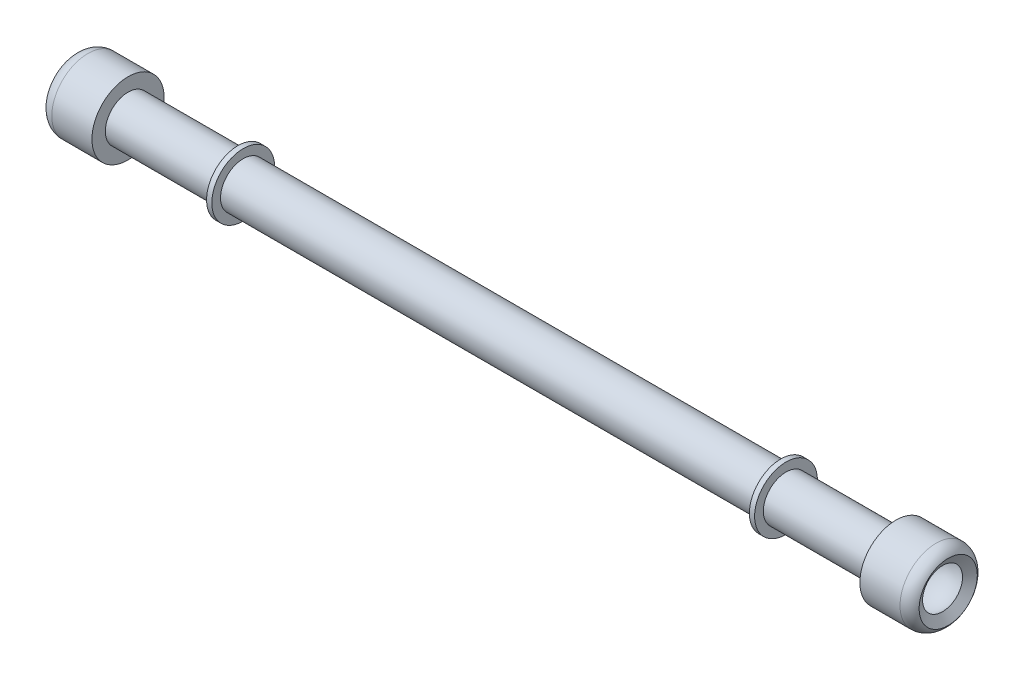
ISO-10303-21;
HEADER;
FILE_DESCRIPTION(('STEP AP214'),'2;1');
FILE_NAME('part.step','',(''),(''),'','','');
FILE_SCHEMA(('AUTOMOTIVE_DESIGN { 1 0 10303 214 1 1 1 1 }'));
ENDSEC;
DATA;
#1=APPLICATION_CONTEXT('core data for automotive mechanical design processes');
#2=APPLICATION_PROTOCOL_DEFINITION('international standard','automotive_design',2000,#1);
#3=PRODUCT_CONTEXT('',#1,'mechanical');
#4=PRODUCT('Part','Part','',(#3));
#5=PRODUCT_RELATED_PRODUCT_CATEGORY('part','',(#4));
#6=PRODUCT_DEFINITION_FORMATION('','',#4);
#7=PRODUCT_DEFINITION_CONTEXT('part definition',#1,'design');
#8=PRODUCT_DEFINITION('design','',#6,#7);
#9=PRODUCT_DEFINITION_SHAPE('','',#8);
#10=(LENGTH_UNIT() NAMED_UNIT(*) SI_UNIT(.MILLI.,.METRE.));
#11=(NAMED_UNIT(*) PLANE_ANGLE_UNIT() SI_UNIT($,.RADIAN.));
#12=(NAMED_UNIT(*) SI_UNIT($,.STERADIAN.) SOLID_ANGLE_UNIT());
#13=UNCERTAINTY_MEASURE_WITH_UNIT(LENGTH_MEASURE(1.E-05),#10,'distance_accuracy_value','');
#14=(GEOMETRIC_REPRESENTATION_CONTEXT(3) GLOBAL_UNCERTAINTY_ASSIGNED_CONTEXT((#13)) GLOBAL_UNIT_ASSIGNED_CONTEXT((#10,
#11,#12)) REPRESENTATION_CONTEXT('',''));
#15=CARTESIAN_POINT('',(0.,0.,0.));
#16=DIRECTION('',(0.,0.,1.));
#17=DIRECTION('',(1.,0.,0.));
#18=AXIS2_PLACEMENT_3D('',#15,#16,#17);
#19=CARTESIAN_POINT('',(220.,0.,0.));
#20=DIRECTION('',(-1.,0.,0.));
#21=DIRECTION('',(0.,0.,1.));
#22=AXIS2_PLACEMENT_3D('',#19,#20,#21);
#23=CYLINDRICAL_SURFACE('',#22,13.);
#24=CARTESIAN_POINT('',(154.,0.,0.));
#25=DIRECTION('',(1.,0.,0.));
#26=DIRECTION('',(0.,0.,-1.));
#27=AXIS2_PLACEMENT_3D('',#24,#25,#26);
#28=CIRCLE('',#27,13.);
#29=CARTESIAN_POINT('',(154.,0.,-13.));
#30=VERTEX_POINT('',#29);
#31=EDGE_CURVE('E65',#30,#30,#28,.T.);
#32=ORIENTED_EDGE('',*,*,#31,.F.);
#33=EDGE_LOOP('',(#32));
#34=FACE_BOUND('',#33,.T.);
#35=CARTESIAN_POINT('',(-154.,0.,0.));
#36=DIRECTION('',(-1.,0.,0.));
#37=DIRECTION('',(0.,0.,1.));
#38=AXIS2_PLACEMENT_3D('',#35,#36,#37);
#39=CIRCLE('',#38,13.);
#40=CARTESIAN_POINT('',(-154.,0.,13.));
#41=VERTEX_POINT('',#40);
#42=EDGE_CURVE('E10',#41,#41,#39,.T.);
#43=ORIENTED_EDGE('',*,*,#42,.F.);
#44=EDGE_LOOP('',(#43));
#45=FACE_BOUND('',#44,.T.);
#46=ADVANCED_FACE('F41',(#34,#45),#23,.T.);
#47=CARTESIAN_POINT('',(157.,0.,0.));
#48=DIRECTION('',(1.,0.,0.));
#49=DIRECTION('',(0.,0.,-1.));
#50=AXIS2_PLACEMENT_3D('',#47,#48,#49);
#51=CIRCLE('',#50,13.);
#52=CARTESIAN_POINT('',(157.,0.,-13.));
#53=VERTEX_POINT('',#52);
#54=EDGE_CURVE('E66',#53,#53,#51,.T.);
#55=ORIENTED_EDGE('',*,*,#54,.T.);
#56=EDGE_LOOP('',(#55));
#57=FACE_BOUND('',#56,.T.);
#58=CARTESIAN_POINT('',(220.,0.,0.));
#59=DIRECTION('',(1.,0.,0.));
#60=DIRECTION('',(0.,0.,-1.));
#61=AXIS2_PLACEMENT_3D('',#58,#59,#60);
#62=CIRCLE('',#61,13.);
#63=CARTESIAN_POINT('',(220.,0.,-13.));
#64=VERTEX_POINT('',#63);
#65=EDGE_CURVE('E82',#64,#64,#62,.T.);
#66=ORIENTED_EDGE('',*,*,#65,.F.);
#67=EDGE_LOOP('',(#66));
#68=FACE_BOUND('',#67,.T.);
#69=ADVANCED_FACE('F127',(#57,#68),#23,.T.);
#70=CARTESIAN_POINT('',(251.,0.,0.));
#71=DIRECTION('',(-1.,0.,0.));
#72=DIRECTION('',(0.,0.,1.));
#73=AXIS2_PLACEMENT_3D('',#70,#71,#72);
#74=CYLINDRICAL_SURFACE('',#73,20.690094219506);
#75=CARTESIAN_POINT('',(243.,0.,0.));
#76=DIRECTION('',(1.,0.,0.));
#77=DIRECTION('',(0.,0.,-1.));
#78=AXIS2_PLACEMENT_3D('',#75,#76,#77);
#79=CIRCLE('',#78,20.690094219506);
#80=CARTESIAN_POINT('',(243.,0.,-20.690094219506));
#81=VERTEX_POINT('',#80);
#82=EDGE_CURVE('E79',#81,#81,#79,.F.);
#83=ORIENTED_EDGE('',*,*,#82,.T.);
#84=EDGE_LOOP('',(#83));
#85=FACE_BOUND('',#84,.T.);
#86=CARTESIAN_POINT('',(220.,0.,0.));
#87=DIRECTION('',(1.,0.,0.));
#88=DIRECTION('',(0.,0.,-1.));
#89=AXIS2_PLACEMENT_3D('',#86,#87,#88);
#90=CIRCLE('',#89,20.690094219506);
#91=CARTESIAN_POINT('',(220.,0.,-20.690094219506));
#92=VERTEX_POINT('',#91);
#93=EDGE_CURVE('E69',#92,#92,#90,.T.);
#94=ORIENTED_EDGE('',*,*,#93,.T.);
#95=EDGE_LOOP('',(#94));
#96=FACE_BOUND('',#95,.T.);
#97=ADVANCED_FACE('F134',(#85,#96),#74,.T.);
#98=CARTESIAN_POINT('',(220.,0.,0.));
#99=DIRECTION('',(1.,0.,0.));
#100=DIRECTION('',(0.,0.,-1.));
#101=AXIS2_PLACEMENT_3D('',#98,#99,#100);
#102=PLANE('',#101);
#103=ORIENTED_EDGE('',*,*,#65,.T.);
#104=EDGE_LOOP('',(#103));
#105=FACE_BOUND('',#104,.T.);
#106=ORIENTED_EDGE('',*,*,#93,.F.);
#107=EDGE_LOOP('',(#106));
#108=FACE_BOUND('',#107,.T.);
#109=ADVANCED_FACE('F179',(#105,#108),#102,.F.);
#110=CARTESIAN_POINT('',(243.,0.,0.));
#111=DIRECTION('',(1.,0.,0.));
#112=DIRECTION('',(0.,0.,-1.));
#113=AXIS2_PLACEMENT_3D('',#110,#111,#112);
#114=TOROIDAL_SURFACE('',#113,12.690094219506,8.);
#115=CARTESIAN_POINT('',(249.938653286796,0.,0.));
#116=DIRECTION('',(-1.,0.,0.));
#117=DIRECTION('',(0.,0.,1.));
#118=AXIS2_PLACEMENT_3D('',#115,#116,#117);
#119=CIRCLE('',#118,16.6719393402556);
#120=CARTESIAN_POINT('',(249.938653286796,0.,16.6719393402556));
#121=VERTEX_POINT('',#120);
#122=EDGE_CURVE('E73',#121,#121,#119,.T.);
#123=ORIENTED_EDGE('',*,*,#122,.T.);
#124=EDGE_LOOP('',(#123));
#125=FACE_BOUND('',#124,.T.);
#126=ORIENTED_EDGE('',*,*,#82,.F.);
#127=EDGE_LOOP('',(#126));
#128=FACE_BOUND('',#127,.T.);
#129=ADVANCED_FACE('F177',(#125,#128),#114,.T.);
#130=CARTESIAN_POINT('',(237.,0.,0.));
#131=DIRECTION('',(0.,0.,-1.));
#132=DIRECTION('',(0.,1.,0.));
#133=AXIS2_PLACEMENT_3D('',#130,#131,#132);
#134=SPHERICAL_SURFACE('',#133,15.);
#135=CARTESIAN_POINT('',(237.,0.,0.));
#136=DIRECTION('',(-1.,0.,0.));
#137=DIRECTION('',(0.,0.,1.));
#138=AXIS2_PLACEMENT_3D('',#135,#136,#137);
#139=SPHERICAL_SURFACE('',#138,15.);
#140=CARTESIAN_POINT('',(246.699355741803,0.,0.));
#141=DIRECTION('',(-1.,0.,0.));
#142=DIRECTION('',(0.,0.,1.));
#143=AXIS2_PLACEMENT_3D('',#140,#141,#142);
#144=CIRCLE('',#143,11.4421369592376);
#145=CARTESIAN_POINT('',(246.699355741803,0.,11.4421369592376));
#146=VERTEX_POINT('',#145);
#147=EDGE_CURVE('E76',#146,#146,#144,.F.);
#148=ORIENTED_EDGE('',*,*,#147,.T.);
#149=EDGE_LOOP('',(#148));
#150=FACE_BOUND('',#149,.T.);
#151=ADVANCED_FACE('F174',(#150),#139,.F.);
#152=CARTESIAN_POINT('',(246.699355741803,0.,0.));
#153=DIRECTION('',(1.,0.,0.));
#154=DIRECTION('',(0.,0.,-1.));
#155=AXIS2_PLACEMENT_3D('',#152,#153,#154);
#156=CONICAL_SURFACE('',#155,11.4421369592376,1.01623992768622);
#157=ORIENTED_EDGE('',*,*,#122,.F.);
#158=EDGE_LOOP('',(#157));
#159=FACE_BOUND('',#158,.T.);
#160=ORIENTED_EDGE('',*,*,#147,.F.);
#161=EDGE_LOOP('',(#160));
#162=FACE_BOUND('',#161,.T.);
#163=ADVANCED_FACE('F172',(#159,#162),#156,.F.);
#164=CARTESIAN_POINT('',(157.,0.,0.));
#165=DIRECTION('',(-1.,0.,0.));
#166=DIRECTION('',(0.,0.,1.));
#167=AXIS2_PLACEMENT_3D('',#164,#165,#166);
#168=CYLINDRICAL_SURFACE('',#167,18.);
#169=CARTESIAN_POINT('',(157.,0.,0.));
#170=DIRECTION('',(1.,0.,0.));
#171=DIRECTION('',(0.,0.,-1.));
#172=AXIS2_PLACEMENT_3D('',#169,#170,#171);
#173=CIRCLE('',#172,18.);
#174=CARTESIAN_POINT('',(157.,0.,-18.));
#175=VERTEX_POINT('',#174);
#176=EDGE_CURVE('E70',#175,#175,#173,.T.);
#177=ORIENTED_EDGE('',*,*,#176,.F.);
#178=EDGE_LOOP('',(#177));
#179=FACE_BOUND('',#178,.T.);
#180=CARTESIAN_POINT('',(154.,0.,0.));
#181=DIRECTION('',(1.,0.,0.));
#182=DIRECTION('',(0.,0.,-1.));
#183=AXIS2_PLACEMENT_3D('',#180,#181,#182);
#184=CIRCLE('',#183,18.);
#185=CARTESIAN_POINT('',(154.,0.,-18.));
#186=VERTEX_POINT('',#185);
#187=EDGE_CURVE('E86',#186,#186,#184,.T.);
#188=ORIENTED_EDGE('',*,*,#187,.T.);
#189=EDGE_LOOP('',(#188));
#190=FACE_BOUND('',#189,.T.);
#191=ADVANCED_FACE('F165',(#179,#190),#168,.T.);
#192=CARTESIAN_POINT('',(157.,0.,0.));
#193=DIRECTION('',(1.,0.,0.));
#194=DIRECTION('',(0.,0.,-1.));
#195=AXIS2_PLACEMENT_3D('',#192,#193,#194);
#196=PLANE('',#195);
#197=ORIENTED_EDGE('',*,*,#54,.F.);
#198=EDGE_LOOP('',(#197));
#199=FACE_BOUND('',#198,.T.);
#200=ORIENTED_EDGE('',*,*,#176,.T.);
#201=EDGE_LOOP('',(#200));
#202=FACE_BOUND('',#201,.T.);
#203=ADVANCED_FACE('F162',(#199,#202),#196,.T.);
#204=CARTESIAN_POINT('',(154.,0.,0.));
#205=DIRECTION('',(1.,0.,0.));
#206=DIRECTION('',(0.,0.,-1.));
#207=AXIS2_PLACEMENT_3D('',#204,#205,#206);
#208=PLANE('',#207);
#209=ORIENTED_EDGE('',*,*,#31,.T.);
#210=EDGE_LOOP('',(#209));
#211=FACE_BOUND('',#210,.T.);
#212=ORIENTED_EDGE('',*,*,#187,.F.);
#213=EDGE_LOOP('',(#212));
#214=FACE_BOUND('',#213,.T.);
#215=ADVANCED_FACE('F124',(#211,#214),#208,.F.);
#216=CARTESIAN_POINT('',(-157.,0.,0.));
#217=DIRECTION('',(1.,0.,0.));
#218=DIRECTION('',(0.,0.,-1.));
#219=AXIS2_PLACEMENT_3D('',#216,#217,#218);
#220=CYLINDRICAL_SURFACE('',#219,18.);
#221=CARTESIAN_POINT('',(-157.,0.,0.));
#222=DIRECTION('',(1.,0.,0.));
#223=DIRECTION('',(0.,0.,-1.));
#224=AXIS2_PLACEMENT_3D('',#221,#222,#223);
#225=CIRCLE('',#224,18.);
#226=CARTESIAN_POINT('',(-157.,0.,-18.));
#227=VERTEX_POINT('',#226);
#228=EDGE_CURVE('E101',#227,#227,#225,.T.);
#229=ORIENTED_EDGE('',*,*,#228,.T.);
#230=EDGE_LOOP('',(#229));
#231=FACE_BOUND('',#230,.T.);
#232=CARTESIAN_POINT('',(-154.,0.,0.));
#233=DIRECTION('',(1.,0.,0.));
#234=DIRECTION('',(0.,0.,-1.));
#235=AXIS2_PLACEMENT_3D('',#232,#233,#234);
#236=CIRCLE('',#235,18.);
#237=CARTESIAN_POINT('',(-154.,0.,-18.));
#238=VERTEX_POINT('',#237);
#239=EDGE_CURVE('E98',#238,#238,#236,.T.);
#240=ORIENTED_EDGE('',*,*,#239,.F.);
#241=EDGE_LOOP('',(#240));
#242=FACE_BOUND('',#241,.T.);
#243=ADVANCED_FACE('F115',(#231,#242),#220,.T.);
#244=CARTESIAN_POINT('',(-157.,0.,0.));
#245=DIRECTION('',(-1.,0.,0.));
#246=DIRECTION('',(0.,0.,-1.));
#247=AXIS2_PLACEMENT_3D('',#244,#245,#246);
#248=PLANE('',#247);
#249=CARTESIAN_POINT('',(-157.,0.,0.));
#250=DIRECTION('',(-1.,0.,0.));
#251=DIRECTION('',(0.,0.,1.));
#252=AXIS2_PLACEMENT_3D('',#249,#250,#251);
#253=CIRCLE('',#252,13.);
#254=CARTESIAN_POINT('',(-157.,0.,13.));
#255=VERTEX_POINT('',#254);
#256=EDGE_CURVE('E46',#255,#255,#253,.T.);
#257=ORIENTED_EDGE('',*,*,#256,.F.);
#258=EDGE_LOOP('',(#257));
#259=FACE_BOUND('',#258,.T.);
#260=ORIENTED_EDGE('',*,*,#228,.F.);
#261=EDGE_LOOP('',(#260));
#262=FACE_BOUND('',#261,.T.);
#263=ADVANCED_FACE('F111',(#259,#262),#248,.T.);
#264=CARTESIAN_POINT('',(-154.,0.,0.));
#265=DIRECTION('',(-1.,0.,0.));
#266=DIRECTION('',(0.,0.,-1.));
#267=AXIS2_PLACEMENT_3D('',#264,#265,#266);
#268=PLANE('',#267);
#269=ORIENTED_EDGE('',*,*,#42,.T.);
#270=EDGE_LOOP('',(#269));
#271=FACE_BOUND('',#270,.T.);
#272=ORIENTED_EDGE('',*,*,#239,.T.);
#273=EDGE_LOOP('',(#272));
#274=FACE_BOUND('',#273,.T.);
#275=ADVANCED_FACE('F114',(#271,#274),#268,.F.);
#276=CARTESIAN_POINT('',(-237.,0.,0.));
#277=DIRECTION('',(0.,0.,-1.));
#278=DIRECTION('',(0.,1.,0.));
#279=AXIS2_PLACEMENT_3D('',#276,#277,#278);
#280=SPHERICAL_SURFACE('',#279,15.);
#281=CARTESIAN_POINT('',(-237.,0.,0.));
#282=DIRECTION('',(1.,0.,0.));
#283=DIRECTION('',(0.,0.,-1.));
#284=AXIS2_PLACEMENT_3D('',#281,#282,#283);
#285=SPHERICAL_SURFACE('',#284,15.);
#286=CARTESIAN_POINT('',(-243.568850988811,0.,0.));
#287=DIRECTION('',(1.,0.,0.));
#288=DIRECTION('',(0.,0.,-1.));
#289=AXIS2_PLACEMENT_3D('',#286,#287,#288);
#290=CIRCLE('',#289,13.4851843401118);
#291=CARTESIAN_POINT('',(-243.568850988811,0.,-13.4851843401118));
#292=VERTEX_POINT('',#291);
#293=EDGE_CURVE('E54',#292,#292,#290,.F.);
#294=ORIENTED_EDGE('',*,*,#293,.T.);
#295=EDGE_LOOP('',(#294));
#296=FACE_BOUND('',#295,.T.);
#297=ADVANCED_FACE('F122',(#296),#285,.F.);
#298=CARTESIAN_POINT('',(-243.568850988811,0.,0.));
#299=DIRECTION('',(1.,0.,0.));
#300=DIRECTION('',(0.,0.,-1.));
#301=AXIS2_PLACEMENT_3D('',#298,#299,#300);
#302=CONICAL_SURFACE('',#301,13.4851843401118,0.313587644342779);
#303=CARTESIAN_POINT('',(-251.,0.,0.));
#304=DIRECTION('',(-1.,0.,0.));
#305=DIRECTION('',(0.,0.,1.));
#306=AXIS2_PLACEMENT_3D('',#303,#304,#305);
#307=CIRCLE('',#306,11.0753530423962);
#308=CARTESIAN_POINT('',(-251.,0.,-11.0753530423962));
#309=VERTEX_POINT('',#308);
#310=EDGE_CURVE('E50',#309,#309,#307,.F.);
#311=CARTESIAN_POINT('',(-251.,0.,-11.0753530423962));
#312=CARTESIAN_POINT('',(-250.9225921978,0.,-11.1004554517474));
#313=CARTESIAN_POINT('',(-250.8451843956,0.,-11.1255578610986));
#314=CARTESIAN_POINT('',(-250.6903687912,0.,-11.175762679801));
#315=CARTESIAN_POINT('',(-250.612960989001,0.,-11.2008650891522));
#316=CARTESIAN_POINT('',(-250.458145384601,0.,-11.2510699078546));
#317=CARTESIAN_POINT('',(-250.380737582401,0.,-11.2761723172059));
#318=CARTESIAN_POINT('',(-250.225921978001,0.,-11.3263771359083));
#319=CARTESIAN_POINT('',(-250.148514175801,0.,-11.3514795452595));
#320=CARTESIAN_POINT('',(-249.993698571401,0.,-11.4016843639619));
#321=CARTESIAN_POINT('',(-249.916290769202,0.,-11.4267867733131));
#322=CARTESIAN_POINT('',(-249.761475164802,0.,-11.4769915920155));
#323=CARTESIAN_POINT('',(-249.684067362602,0.,-11.5020940013667));
#324=CARTESIAN_POINT('',(-249.529251758202,0.,-11.5522988200691));
#325=CARTESIAN_POINT('',(-249.451843956002,0.,-11.5774012294203));
#326=CARTESIAN_POINT('',(-249.297028351603,0.,-11.6276060481227));
#327=CARTESIAN_POINT('',(-249.219620549403,0.,-11.6527084574739));
#328=CARTESIAN_POINT('',(-249.064804945003,0.,-11.7029132761763));
#329=CARTESIAN_POINT('',(-248.987397142803,0.,-11.7280156855275));
#330=CARTESIAN_POINT('',(-248.832581538403,0.,-11.7782205042299));
#331=CARTESIAN_POINT('',(-248.755173736203,0.,-11.8033229135811));
#332=CARTESIAN_POINT('',(-248.600358131804,0.,-11.8535277322835));
#333=CARTESIAN_POINT('',(-248.522950329604,0.,-11.8786301416347));
#334=CARTESIAN_POINT('',(-248.368134725204,0.,-11.9288349603371));
#335=CARTESIAN_POINT('',(-248.290726923004,0.,-11.9539373696883));
#336=CARTESIAN_POINT('',(-248.135911318604,0.,-12.0041421883908));
#337=CARTESIAN_POINT('',(-248.058503516404,0.,-12.029244597742));
#338=CARTESIAN_POINT('',(-247.903687912005,0.,-12.0794494164444));
#339=CARTESIAN_POINT('',(-247.826280109805,0.,-12.1045518257956));
#340=CARTESIAN_POINT('',(-247.671464505405,0.,-12.154756644498));
#341=CARTESIAN_POINT('',(-247.594056703205,0.,-12.1798590538492));
#342=CARTESIAN_POINT('',(-247.439241098805,0.,-12.2300638725516));
#343=CARTESIAN_POINT('',(-247.361833296605,0.,-12.2551662819028));
#344=CARTESIAN_POINT('',(-247.207017692206,0.,-12.3053711006052));
#345=CARTESIAN_POINT('',(-247.129609890006,0.,-12.3304735099564));
#346=CARTESIAN_POINT('',(-246.974794285606,0.,-12.3806783286588));
#347=CARTESIAN_POINT('',(-246.897386483406,0.,-12.40578073801));
#348=CARTESIAN_POINT('',(-246.742570879006,0.,-12.4559855567124));
#349=CARTESIAN_POINT('',(-246.665163076806,0.,-12.4810879660636));
#350=CARTESIAN_POINT('',(-246.510347472407,0.,-12.531292784766));
#351=CARTESIAN_POINT('',(-246.432939670207,0.,-12.5563951941172));
#352=CARTESIAN_POINT('',(-246.278124065807,0.,-12.6066000128196));
#353=CARTESIAN_POINT('',(-246.200716263607,0.,-12.6317024221708));
#354=CARTESIAN_POINT('',(-246.045900659207,0.,-12.6819072408732));
#355=CARTESIAN_POINT('',(-245.968492857008,0.,-12.7070096502244));
#356=CARTESIAN_POINT('',(-245.813677252608,0.,-12.7572144689269));
#357=CARTESIAN_POINT('',(-245.736269450408,0.,-12.7823168782781));
#358=CARTESIAN_POINT('',(-245.581453846008,0.,-12.8325216969805));
#359=CARTESIAN_POINT('',(-245.504046043808,0.,-12.8576241063317));
#360=CARTESIAN_POINT('',(-245.349230439408,0.,-12.9078289250341));
#361=CARTESIAN_POINT('',(-245.271822637209,0.,-12.9329313343853));
#362=CARTESIAN_POINT('',(-245.117007032809,0.,-12.9831361530877));
#363=CARTESIAN_POINT('',(-245.039599230609,0.,-13.0082385624389));
#364=CARTESIAN_POINT('',(-244.884783626209,0.,-13.0584433811413));
#365=CARTESIAN_POINT('',(-244.807375824009,0.,-13.0835457904925));
#366=CARTESIAN_POINT('',(-244.652560219609,0.,-13.1337506091949));
#367=CARTESIAN_POINT('',(-244.57515241741,0.,-13.1588530185461));
#368=CARTESIAN_POINT('',(-244.42033681301,0.,-13.2090578372485));
#369=CARTESIAN_POINT('',(-244.34292901081,0.,-13.2341602465997));
#370=CARTESIAN_POINT('',(-244.18811340641,0.,-13.2843650653021));
#371=CARTESIAN_POINT('',(-244.11070560421,0.,-13.3094674746533));
#372=CARTESIAN_POINT('',(-243.955889999811,0.,-13.3596722933557));
#373=CARTESIAN_POINT('',(-243.878482197611,0.,-13.3847747027069));
#374=CARTESIAN_POINT('',(-243.723666593211,0.,-13.4349795214093));
#375=CARTESIAN_POINT('',(-243.646258791011,0.,-13.4600819307606));
#376=CARTESIAN_POINT('',(-243.568850988811,0.,-13.4851843401118));
#377=B_SPLINE_CURVE_WITH_KNOTS('',3,(#311,#312,#313,#314,#315,#316,#317,#318,#319,#320,#321,
#322,#323,#324,#325,#326,#327,#328,#329,#330,#331,#332,#333,#334,#335,#336,#337,#338,#339,#340,
#341,#342,#343,#344,#345,#346,#347,#348,#349,#350,#351,#352,#353,#354,#355,#356,#357,#358,#359,
#360,#361,#362,#363,#364,#365,#366,#367,#368,#369,#370,#371,#372,#373,#374,#375,#376),
.UNSPECIFIED.,.F.,.F.,(4,2,2,2,2,2,2,2,2,2,2,2,2,2,2,2,2,2,2,2,2,2,2,2,2,2,2,2,2,2,2,2,4),(0.,
0.244128837235281,0.488257674470615,0.732386511705896,0.97651534894123,1.22064418617654,
1.46477302341184,1.70890186064715,1.95303069788249,2.19715953511779,2.4412883723531,
2.68541720958841,2.92954604682372,3.17367488405905,3.41780372129436,3.66193255852966,
3.90606139576497,4.15019023300028,4.39431907023561,4.63844790747092,4.88257674470623,
5.12670558194153,5.37083441917684,5.61496325641218,5.85909209364748,6.10322093088279,
6.3473497681181,6.59147860535343,6.83560744258874,7.07973627982405,7.32386511705935,
7.56799395429466,7.81212279153),.UNSPECIFIED.);
#378=EDGE_CURVE('BSEAM44',#309,#292,#377,.T.);
#379=ORIENTED_EDGE('',*,*,#310,.F.);
#380=ORIENTED_EDGE('',*,*,#293,.F.);
#381=ORIENTED_EDGE('',*,*,#378,.T.);
#382=ORIENTED_EDGE('',*,*,#378,.F.);
#383=EDGE_LOOP('',(#379,#381,#380,#382));
#384=FACE_BOUND('',#383,.T.);
#385=ADVANCED_FACE('F44',(#384),#302,.F.);
#386=CARTESIAN_POINT('',(-251.,0.,0.));
#387=DIRECTION('',(-1.,0.,0.));
#388=DIRECTION('',(0.,0.,-1.));
#389=AXIS2_PLACEMENT_3D('',#386,#387,#388);
#390=PLANE('',#389);
#391=ORIENTED_EDGE('',*,*,#310,.T.);
#392=EDGE_LOOP('',(#391));
#393=FACE_BOUND('',#392,.T.);
#394=CARTESIAN_POINT('',(-251.,0.,0.));
#395=DIRECTION('',(-1.,0.,0.));
#396=DIRECTION('',(0.,0.,1.));
#397=AXIS2_PLACEMENT_3D('',#394,#395,#396);
#398=CIRCLE('',#397,12.690094219506);
#399=CARTESIAN_POINT('',(-251.,0.,12.690094219506));
#400=VERTEX_POINT('',#399);
#401=EDGE_CURVE('E59',#400,#400,#398,.T.);
#402=ORIENTED_EDGE('',*,*,#401,.T.);
#403=EDGE_LOOP('',(#402));
#404=FACE_BOUND('',#403,.T.);
#405=ADVANCED_FACE('F159',(#393,#404),#390,.T.);
#406=CARTESIAN_POINT('',(-243.,0.,0.));
#407=DIRECTION('',(-1.,0.,0.));
#408=DIRECTION('',(0.,0.,1.));
#409=AXIS2_PLACEMENT_3D('',#406,#407,#408);
#410=TOROIDAL_SURFACE('',#409,12.690094219506,8.);
#411=ORIENTED_EDGE('',*,*,#401,.F.);
#412=EDGE_LOOP('',(#411));
#413=FACE_BOUND('',#412,.T.);
#414=CARTESIAN_POINT('',(-243.,0.,0.));
#415=DIRECTION('',(-1.,0.,0.));
#416=DIRECTION('',(0.,0.,1.));
#417=AXIS2_PLACEMENT_3D('',#414,#415,#416);
#418=CIRCLE('',#417,20.690094219506);
#419=CARTESIAN_POINT('',(-243.,0.,20.690094219506));
#420=VERTEX_POINT('',#419);
#421=EDGE_CURVE('E62',#420,#420,#418,.F.);
#422=ORIENTED_EDGE('',*,*,#421,.F.);
#423=EDGE_LOOP('',(#422));
#424=FACE_BOUND('',#423,.T.);
#425=ADVANCED_FACE('F153',(#413,#424),#410,.T.);
#426=CARTESIAN_POINT('',(-251.,0.,0.));
#427=DIRECTION('',(1.,0.,0.));
#428=DIRECTION('',(0.,0.,-1.));
#429=AXIS2_PLACEMENT_3D('',#426,#427,#428);
#430=CYLINDRICAL_SURFACE('',#429,20.690094219506);
#431=ORIENTED_EDGE('',*,*,#421,.T.);
#432=EDGE_LOOP('',(#431));
#433=FACE_BOUND('',#432,.T.);
#434=CARTESIAN_POINT('',(-220.,0.,0.));
#435=DIRECTION('',(1.,0.,0.));
#436=DIRECTION('',(0.,0.,-1.));
#437=AXIS2_PLACEMENT_3D('',#434,#435,#436);
#438=CIRCLE('',#437,20.690094219506);
#439=CARTESIAN_POINT('',(-220.,0.,-20.690094219506));
#440=VERTEX_POINT('',#439);
#441=EDGE_CURVE('E87',#440,#440,#438,.T.);
#442=ORIENTED_EDGE('',*,*,#441,.F.);
#443=EDGE_LOOP('',(#442));
#444=FACE_BOUND('',#443,.T.);
#445=ADVANCED_FACE('F146',(#433,#444),#430,.T.);
#446=CARTESIAN_POINT('',(-220.,0.,0.));
#447=DIRECTION('',(-1.,0.,0.));
#448=DIRECTION('',(0.,0.,-1.));
#449=AXIS2_PLACEMENT_3D('',#446,#447,#448);
#450=PLANE('',#449);
#451=CARTESIAN_POINT('',(-220.,0.,0.));
#452=DIRECTION('',(1.,0.,0.));
#453=DIRECTION('',(0.,0.,-1.));
#454=AXIS2_PLACEMENT_3D('',#451,#452,#453);
#455=CIRCLE('',#454,13.);
#456=CARTESIAN_POINT('',(-220.,0.,-13.));
#457=VERTEX_POINT('',#456);
#458=EDGE_CURVE('E83',#457,#457,#455,.T.);
#459=ORIENTED_EDGE('',*,*,#458,.F.);
#460=EDGE_LOOP('',(#459));
#461=FACE_BOUND('',#460,.T.);
#462=ORIENTED_EDGE('',*,*,#441,.T.);
#463=EDGE_LOOP('',(#462));
#464=FACE_BOUND('',#463,.T.);
#465=ADVANCED_FACE('F141',(#461,#464),#450,.F.);
#466=ORIENTED_EDGE('',*,*,#256,.T.);
#467=EDGE_LOOP('',(#466));
#468=FACE_BOUND('',#467,.T.);
#469=ORIENTED_EDGE('',*,*,#458,.T.);
#470=EDGE_LOOP('',(#469));
#471=FACE_BOUND('',#470,.T.);
#472=ADVANCED_FACE('F108',(#468,#471),#23,.T.);
#473=CLOSED_SHELL('',(#46,#69,#97,#109,#129,#151,#163,#191,#203,#215,#243,#263,#275,#297,#385,
#405,#425,#445,#465,#472));
#474=MANIFOLD_SOLID_BREP('B2',#473);
#475=ADVANCED_BREP_SHAPE_REPRESENTATION('',(#18,#474),#14);
#476=SHAPE_DEFINITION_REPRESENTATION(#9,#475);
ENDSEC;
END-ISO-10303-21;
